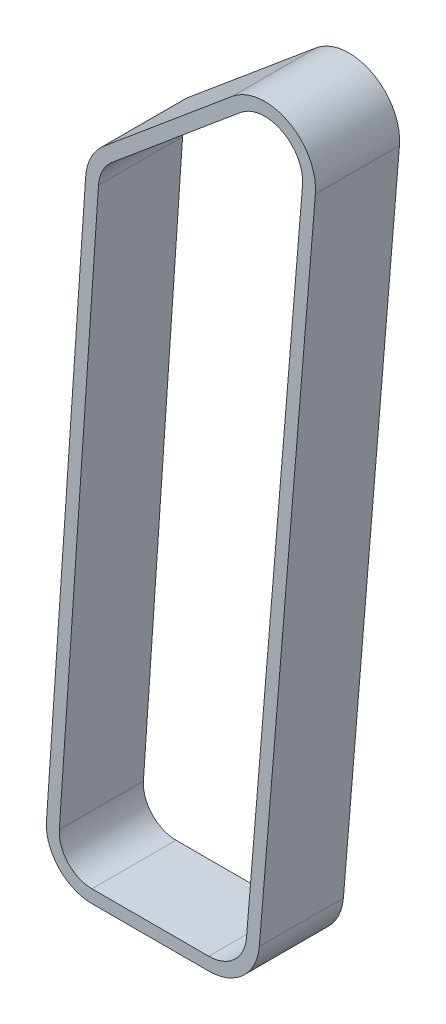
ISO-10303-21;
HEADER;
FILE_DESCRIPTION(('STEP AP214'),'2;1');
FILE_NAME('part.step','',(''),(''),'','','');
FILE_SCHEMA(('AUTOMOTIVE_DESIGN { 1 0 10303 214 1 1 1 1 }'));
ENDSEC;
DATA;
#1=APPLICATION_CONTEXT('core data for automotive mechanical design processes');
#2=APPLICATION_PROTOCOL_DEFINITION('international standard','automotive_design',2000,#1);
#3=PRODUCT_CONTEXT('',#1,'mechanical');
#4=PRODUCT('Part','Part','',(#3));
#5=PRODUCT_RELATED_PRODUCT_CATEGORY('part','',(#4));
#6=PRODUCT_DEFINITION_FORMATION('','',#4);
#7=PRODUCT_DEFINITION_CONTEXT('part definition',#1,'design');
#8=PRODUCT_DEFINITION('design','',#6,#7);
#9=PRODUCT_DEFINITION_SHAPE('','',#8);
#10=(LENGTH_UNIT() NAMED_UNIT(*) SI_UNIT(.MILLI.,.METRE.));
#11=(NAMED_UNIT(*) PLANE_ANGLE_UNIT() SI_UNIT($,.RADIAN.));
#12=(NAMED_UNIT(*) SI_UNIT($,.STERADIAN.) SOLID_ANGLE_UNIT());
#13=UNCERTAINTY_MEASURE_WITH_UNIT(LENGTH_MEASURE(1.E-05),#10,'distance_accuracy_value','');
#14=(GEOMETRIC_REPRESENTATION_CONTEXT(3) GLOBAL_UNCERTAINTY_ASSIGNED_CONTEXT((#13)) GLOBAL_UNIT_ASSIGNED_CONTEXT((#10,
#11,#12)) REPRESENTATION_CONTEXT('',''));
#15=CARTESIAN_POINT('',(0.,0.,0.));
#16=DIRECTION('',(0.,0.,1.));
#17=DIRECTION('',(1.,0.,0.));
#18=AXIS2_PLACEMENT_3D('',#15,#16,#17);
#19=CARTESIAN_POINT('',(17.0566896246943,83.,9.));
#20=DIRECTION('',(0.,0.,-1.));
#21=DIRECTION('',(-1.,0.,0.));
#22=AXIS2_PLACEMENT_3D('',#19,#20,#21);
#23=CYLINDRICAL_SURFACE('',#22,4.05);
#24=CARTESIAN_POINT('',(17.0566896246943,83.,0.));
#25=DIRECTION('',(0.,0.,1.));
#26=DIRECTION('',(1.,0.,0.));
#27=AXIS2_PLACEMENT_3D('',#24,#25,#26);
#28=CIRCLE('',#27,4.05);
#29=CARTESIAN_POINT('',(21.0929839514263,82.6670914419983,0.));
#30=VERTEX_POINT('',#29);
#31=CARTESIAN_POINT('',(14.4592790918921,86.1074038237873,0.));
#32=VERTEX_POINT('',#31);
#33=EDGE_CURVE('E208',#30,#32,#28,.T.);
#34=ORIENTED_EDGE('',*,*,#33,.F.);
#35=DIRECTION('',(0.,0.,-1.));
#36=VECTOR('',#35,1.);
#37=CARTESIAN_POINT('',(21.0929839514263,82.6670914419983,9.));
#38=LINE('',#37,#36);
#39=CARTESIAN_POINT('',(21.0929839514263,82.6670914419983,9.));
#40=VERTEX_POINT('',#39);
#41=EDGE_CURVE('E11',#40,#30,#38,.T.);
#42=ORIENTED_EDGE('',*,*,#41,.F.);
#43=CARTESIAN_POINT('',(17.0566896246943,83.,9.));
#44=DIRECTION('',(0.,0.,1.));
#45=DIRECTION('',(1.,0.,0.));
#46=AXIS2_PLACEMENT_3D('',#43,#44,#45);
#47=CIRCLE('',#46,4.05);
#48=CARTESIAN_POINT('',(14.4592790918921,86.1074038237873,9.));
#49=VERTEX_POINT('',#48);
#50=EDGE_CURVE('E293',#40,#49,#47,.T.);
#51=ORIENTED_EDGE('',*,*,#50,.T.);
#52=DIRECTION('',(0.,0.,-1.));
#53=VECTOR('',#52,1.);
#54=CARTESIAN_POINT('',(14.4592790918921,86.1074038237873,9.));
#55=LINE('',#54,#53);
#56=EDGE_CURVE('E60',#49,#32,#55,.T.);
#57=ORIENTED_EDGE('',*,*,#56,.T.);
#58=EDGE_LOOP('',(#34,#42,#51,#57));
#59=FACE_BOUND('',#58,.T.);
#60=ADVANCED_FACE('F41',(#59),#23,.F.);
#61=CARTESIAN_POINT('',(14.1782535548242,-1.16940479653789,9.));
#62=DIRECTION('',(-0.996615883143713,0.0821996439510389,0.));
#63=DIRECTION('',(-0.0821996439510389,-0.996615883143713,0.));
#64=AXIS2_PLACEMENT_3D('',#61,#62,#63);
#65=PLANE('',#64);
#66=DIRECTION('',(0.0821996439510389,0.996615883143713,0.));
#67=VECTOR('',#66,1.);
#68=CARTESIAN_POINT('',(14.1782535548242,-1.16940479653789,0.));
#69=LINE('',#68,#67);
#70=CARTESIAN_POINT('',(15.0929839514263,9.92109144199829,0.));
#71=VERTEX_POINT('',#70);
#72=EDGE_CURVE('E210',#71,#30,#69,.T.);
#73=ORIENTED_EDGE('',*,*,#72,.F.);
#74=DIRECTION('',(0.,0.,-1.));
#75=VECTOR('',#74,1.);
#76=CARTESIAN_POINT('',(15.0929839514263,9.92109144199829,9.));
#77=LINE('',#76,#75);
#78=CARTESIAN_POINT('',(15.0929839514263,9.92109144199829,9.));
#79=VERTEX_POINT('',#78);
#80=EDGE_CURVE('E51',#79,#71,#77,.T.);
#81=ORIENTED_EDGE('',*,*,#80,.F.);
#82=DIRECTION('',(0.0821996439510389,0.996615883143713,0.));
#83=VECTOR('',#82,1.);
#84=CARTESIAN_POINT('',(14.1782535548242,-1.16940479653789,9.));
#85=LINE('',#84,#83);
#86=EDGE_CURVE('E295',#79,#40,#85,.T.);
#87=ORIENTED_EDGE('',*,*,#86,.T.);
#88=ORIENTED_EDGE('',*,*,#41,.T.);
#89=EDGE_LOOP('',(#73,#81,#87,#88));
#90=FACE_BOUND('',#89,.T.);
#91=ADVANCED_FACE('F322',(#90),#65,.T.);
#92=CARTESIAN_POINT('',(11.0566896246943,10.254,9.));
#93=DIRECTION('',(0.,0.,-1.));
#94=DIRECTION('',(-1.,0.,0.));
#95=AXIS2_PLACEMENT_3D('',#92,#93,#94);
#96=CYLINDRICAL_SURFACE('',#95,4.05);
#97=CARTESIAN_POINT('',(11.0566896246943,10.254,0.));
#98=DIRECTION('',(0.,0.,1.));
#99=DIRECTION('',(1.,0.,0.));
#100=AXIS2_PLACEMENT_3D('',#97,#98,#99);
#101=CIRCLE('',#100,4.05);
#102=CARTESIAN_POINT('',(11.0566896246943,6.204,0.));
#103=VERTEX_POINT('',#102);
#104=EDGE_CURVE('E213',#103,#71,#101,.T.);
#105=ORIENTED_EDGE('',*,*,#104,.F.);
#106=DIRECTION('',(0.,0.,-1.));
#107=VECTOR('',#106,1.);
#108=CARTESIAN_POINT('',(11.0566896246943,6.204,9.));
#109=LINE('',#108,#107);
#110=CARTESIAN_POINT('',(11.0566896246943,6.204,9.));
#111=VERTEX_POINT('',#110);
#112=EDGE_CURVE('E234',#111,#103,#109,.T.);
#113=ORIENTED_EDGE('',*,*,#112,.F.);
#114=CARTESIAN_POINT('',(11.0566896246943,10.254,9.));
#115=DIRECTION('',(0.,0.,1.));
#116=DIRECTION('',(1.,0.,0.));
#117=AXIS2_PLACEMENT_3D('',#114,#115,#116);
#118=CIRCLE('',#117,4.05);
#119=EDGE_CURVE('E298',#111,#79,#118,.T.);
#120=ORIENTED_EDGE('',*,*,#119,.T.);
#121=ORIENTED_EDGE('',*,*,#80,.T.);
#122=EDGE_LOOP('',(#105,#113,#120,#121));
#123=FACE_BOUND('',#122,.T.);
#124=ADVANCED_FACE('F327',(#123),#96,.F.);
#125=CARTESIAN_POINT('',(0.,6.204,9.));
#126=DIRECTION('',(0.,1.,0.));
#127=DIRECTION('',(-1.,0.,0.));
#128=AXIS2_PLACEMENT_3D('',#125,#126,#127);
#129=PLANE('',#128);
#130=DIRECTION('',(1.,0.,0.));
#131=VECTOR('',#130,1.);
#132=CARTESIAN_POINT('',(0.,6.204,0.));
#133=LINE('',#132,#131);
#134=CARTESIAN_POINT('',(-1.44331037530571,6.204,0.));
#135=VERTEX_POINT('',#134);
#136=EDGE_CURVE('E216',#135,#103,#133,.T.);
#137=ORIENTED_EDGE('',*,*,#136,.F.);
#138=DIRECTION('',(0.,0.,-1.));
#139=VECTOR('',#138,1.);
#140=CARTESIAN_POINT('',(-1.44331037530571,6.204,9.));
#141=LINE('',#140,#139);
#142=CARTESIAN_POINT('',(-1.44331037530571,6.204,9.));
#143=VERTEX_POINT('',#142);
#144=EDGE_CURVE('E232',#143,#135,#141,.T.);
#145=ORIENTED_EDGE('',*,*,#144,.F.);
#146=DIRECTION('',(1.,0.,0.));
#147=VECTOR('',#146,1.);
#148=CARTESIAN_POINT('',(0.,6.204,9.));
#149=LINE('',#148,#147);
#150=EDGE_CURVE('E301',#143,#111,#149,.T.);
#151=ORIENTED_EDGE('',*,*,#150,.T.);
#152=ORIENTED_EDGE('',*,*,#112,.T.);
#153=EDGE_LOOP('',(#137,#145,#151,#152));
#154=FACE_BOUND('',#153,.T.);
#155=ADVANCED_FACE('F360',(#154),#129,.T.);
#156=CARTESIAN_POINT('',(-1.44331037530571,9.705,9.));
#157=DIRECTION('',(0.,0.,-1.));
#158=DIRECTION('',(-1.,0.,0.));
#159=AXIS2_PLACEMENT_3D('',#156,#157,#158);
#160=CYLINDRICAL_SURFACE('',#159,3.501);
#161=CARTESIAN_POINT('',(-1.44331037530571,9.705,0.));
#162=DIRECTION('',(0.,0.,1.));
#163=DIRECTION('',(1.,0.,0.));
#164=AXIS2_PLACEMENT_3D('',#161,#162,#163);
#165=CIRCLE('',#164,3.501);
#166=CARTESIAN_POINT('',(-4.93628342480396,9.94193939199479,0.));
#167=VERTEX_POINT('',#166);
#168=EDGE_CURVE('E219',#167,#135,#165,.T.);
#169=ORIENTED_EDGE('',*,*,#168,.F.);
#170=DIRECTION('',(0.,0.,-1.));
#171=VECTOR('',#170,1.);
#172=CARTESIAN_POINT('',(-4.93628342480396,9.94193939199479,9.));
#173=LINE('',#172,#171);
#174=CARTESIAN_POINT('',(-4.93628342480396,9.94193939199479,9.));
#175=VERTEX_POINT('',#174);
#176=EDGE_CURVE('E171',#175,#167,#173,.T.);
#177=ORIENTED_EDGE('',*,*,#176,.F.);
#178=CARTESIAN_POINT('',(-1.44331037530571,9.705,9.));
#179=DIRECTION('',(0.,0.,1.));
#180=DIRECTION('',(1.,0.,0.));
#181=AXIS2_PLACEMENT_3D('',#178,#179,#180);
#182=CIRCLE('',#181,3.501);
#183=EDGE_CURVE('E182',#175,#143,#182,.T.);
#184=ORIENTED_EDGE('',*,*,#183,.T.);
#185=ORIENTED_EDGE('',*,*,#144,.T.);
#186=EDGE_LOOP('',(#169,#177,#184,#185));
#187=FACE_BOUND('',#186,.T.);
#188=ADVANCED_FACE('F305',(#187),#160,.F.);
#189=CARTESIAN_POINT('',(-5.58497819975959,0.378846707433246,9.));
#190=DIRECTION('',(0.99770724064503,-0.0676776326749045,0.));
#191=DIRECTION('',(0.0676776326749045,0.99770724064503,0.));
#192=AXIS2_PLACEMENT_3D('',#189,#190,#191);
#193=PLANE('',#192);
#194=DIRECTION('',(-0.0676776326749045,-0.99770724064503,0.));
#195=VECTOR('',#194,1.);
#196=CARTESIAN_POINT('',(-5.58497819975959,0.378846707433246,0.));
#197=LINE('',#196,#195);
#198=CARTESIAN_POINT('',(-0.742013097309097,71.7740944123334,0.));
#199=VERTEX_POINT('',#198);
#200=EDGE_CURVE('E167',#199,#167,#197,.T.);
#201=ORIENTED_EDGE('',*,*,#200,.F.);
#202=DIRECTION('',(0.,0.,-1.));
#203=VECTOR('',#202,1.);
#204=CARTESIAN_POINT('',(-0.742013097309097,71.7740944123334,9.));
#205=LINE('',#204,#203);
#206=CARTESIAN_POINT('',(-0.742013097309097,71.7740944123334,9.));
#207=VERTEX_POINT('',#206);
#208=EDGE_CURVE('E162',#207,#199,#205,.T.);
#209=ORIENTED_EDGE('',*,*,#208,.F.);
#210=DIRECTION('',(-0.0676776326749045,-0.99770724064503,0.));
#211=VECTOR('',#210,1.);
#212=CARTESIAN_POINT('',(-5.58497819975959,0.378846707433246,9.));
#213=LINE('',#212,#211);
#214=EDGE_CURVE('E165',#207,#175,#213,.T.);
#215=ORIENTED_EDGE('',*,*,#214,.T.);
#216=ORIENTED_EDGE('',*,*,#176,.T.);
#217=EDGE_LOOP('',(#201,#209,#215,#216));
#218=FACE_BOUND('',#217,.T.);
#219=ADVANCED_FACE('F164',(#218),#193,.T.);
#220=CARTESIAN_POINT('',(3.29870122730328,71.5,9.));
#221=DIRECTION('',(0.,0.,-1.));
#222=DIRECTION('',(-1.,0.,0.));
#223=AXIS2_PLACEMENT_3D('',#220,#221,#222);
#224=CYLINDRICAL_SURFACE('',#223,4.05);
#225=CARTESIAN_POINT('',(3.29870122730328,71.5,0.));
#226=DIRECTION('',(0.,0.,1.));
#227=DIRECTION('',(1.,0.,0.));
#228=AXIS2_PLACEMENT_3D('',#225,#226,#227);
#229=CIRCLE('',#228,4.05);
#230=CARTESIAN_POINT('',(0.701290694501054,74.6074038237874,0.));
#231=VERTEX_POINT('',#230);
#232=EDGE_CURVE('E223',#231,#199,#229,.T.);
#233=ORIENTED_EDGE('',*,*,#232,.F.);
#234=DIRECTION('',(0.,0.,-1.));
#235=VECTOR('',#234,1.);
#236=CARTESIAN_POINT('',(0.701290694501054,74.6074038237874,9.));
#237=LINE('',#236,#235);
#238=CARTESIAN_POINT('',(0.701290694501054,74.6074038237874,9.));
#239=VERTEX_POINT('',#238);
#240=EDGE_CURVE('E109',#239,#231,#237,.T.);
#241=ORIENTED_EDGE('',*,*,#240,.F.);
#242=CARTESIAN_POINT('',(3.29870122730328,71.5,9.));
#243=DIRECTION('',(0.,0.,1.));
#244=DIRECTION('',(1.,0.,0.));
#245=AXIS2_PLACEMENT_3D('',#242,#243,#244);
#246=CIRCLE('',#245,4.05);
#247=EDGE_CURVE('E179',#239,#207,#246,.T.);
#248=ORIENTED_EDGE('',*,*,#247,.T.);
#249=ORIENTED_EDGE('',*,*,#208,.T.);
#250=EDGE_LOOP('',(#233,#241,#248,#249));
#251=FACE_BOUND('',#250,.T.);
#252=ADVANCED_FACE('F184',(#251),#224,.F.);
#253=CARTESIAN_POINT('',(15.5535834735625,-1.28284030519032,9.));
#254=DIRECTION('',(-0.996615883143713,0.0821996439510389,0.));
#255=DIRECTION('',(-0.082199643951039,-0.996615883143713,0.));
#256=AXIS2_PLACEMENT_3D('',#253,#254,#255);
#257=PLANE('',#256);
#258=DIRECTION('',(0.082199643951039,0.996615883143713,0.));
#259=VECTOR('',#258,1.);
#260=CARTESIAN_POINT('',(15.5535834735625,-1.28284030519032,0.));
#261=LINE('',#260,#259);
#262=CARTESIAN_POINT('',(16.4683138701646,9.80765593334586,0.));
#263=VERTEX_POINT('',#262);
#264=CARTESIAN_POINT('',(22.4683138701647,82.5536559333459,0.));
#265=VERTEX_POINT('',#264);
#266=EDGE_CURVE('E191',#263,#265,#261,.T.);
#267=ORIENTED_EDGE('',*,*,#266,.T.);
#268=DIRECTION('',(0.,0.,-1.));
#269=VECTOR('',#268,1.);
#270=CARTESIAN_POINT('',(22.4683138701647,82.5536559333459,9.));
#271=LINE('',#270,#269);
#272=CARTESIAN_POINT('',(22.4683138701647,82.5536559333459,9.));
#273=VERTEX_POINT('',#272);
#274=EDGE_CURVE('E45',#273,#265,#271,.T.);
#275=ORIENTED_EDGE('',*,*,#274,.F.);
#276=DIRECTION('',(0.082199643951039,0.996615883143713,0.));
#277=VECTOR('',#276,1.);
#278=CARTESIAN_POINT('',(15.5535834735625,-1.28284030519032,9.));
#279=LINE('',#278,#277);
#280=CARTESIAN_POINT('',(16.4683138701646,9.80765593334586,9.));
#281=VERTEX_POINT('',#280);
#282=EDGE_CURVE('E228',#281,#273,#279,.T.);
#283=ORIENTED_EDGE('',*,*,#282,.F.);
#284=DIRECTION('',(0.,0.,-1.));
#285=VECTOR('',#284,1.);
#286=CARTESIAN_POINT('',(16.4683138701646,9.80765593334586,9.));
#287=LINE('',#286,#285);
#288=EDGE_CURVE('E187',#281,#263,#287,.T.);
#289=ORIENTED_EDGE('',*,*,#288,.T.);
#290=EDGE_LOOP('',(#267,#275,#283,#289));
#291=FACE_BOUND('',#290,.T.);
#292=ADVANCED_FACE('F43',(#291),#257,.F.);
#293=CARTESIAN_POINT('',(17.0566896246943,83.,9.));
#294=DIRECTION('',(0.,0.,-1.));
#295=DIRECTION('',(-1.,0.,0.));
#296=AXIS2_PLACEMENT_3D('',#293,#294,#295);
#297=CYLINDRICAL_SURFACE('',#296,5.43);
#298=CARTESIAN_POINT('',(17.0566896246943,83.,0.));
#299=DIRECTION('',(0.,0.,1.));
#300=DIRECTION('',(1.,0.,0.));
#301=AXIS2_PLACEMENT_3D('',#298,#299,#300);
#302=CIRCLE('',#301,5.43);
#303=CARTESIAN_POINT('',(13.5742355029372,87.1662229044853,0.));
#304=VERTEX_POINT('',#303);
#305=EDGE_CURVE('E194',#265,#304,#302,.T.);
#306=ORIENTED_EDGE('',*,*,#305,.T.);
#307=DIRECTION('',(0.,0.,-1.));
#308=VECTOR('',#307,1.);
#309=CARTESIAN_POINT('',(13.5742355029372,87.1662229044853,9.));
#310=LINE('',#309,#308);
#311=CARTESIAN_POINT('',(13.5742355029372,87.1662229044853,9.));
#312=VERTEX_POINT('',#311);
#313=EDGE_CURVE('E253',#312,#304,#310,.T.);
#314=ORIENTED_EDGE('',*,*,#313,.F.);
#315=CARTESIAN_POINT('',(17.0566896246943,83.,9.));
#316=DIRECTION('',(0.,0.,1.));
#317=DIRECTION('',(1.,0.,0.));
#318=AXIS2_PLACEMENT_3D('',#315,#316,#317);
#319=CIRCLE('',#318,5.43);
#320=EDGE_CURVE('E122',#273,#312,#319,.T.);
#321=ORIENTED_EDGE('',*,*,#320,.F.);
#322=ORIENTED_EDGE('',*,*,#274,.T.);
#323=EDGE_LOOP('',(#306,#314,#321,#322));
#324=FACE_BOUND('',#323,.T.);
#325=ADVANCED_FACE('F259',(#324),#297,.T.);
#326=CARTESIAN_POINT('',(-37.3087744995029,44.634233624786,9.));
#327=DIRECTION('',(0.64133593402524,-0.767260203404277,0.));
#328=DIRECTION('',(0.767260203404277,0.64133593402524,0.));
#329=AXIS2_PLACEMENT_3D('',#326,#327,#328);
#330=PLANE('',#329);
#331=DIRECTION('',(-0.767260203404277,-0.64133593402524,0.));
#332=VECTOR('',#331,1.);
#333=CARTESIAN_POINT('',(-37.3087744995029,44.634233624786,0.));
#334=LINE('',#333,#332);
#335=CARTESIAN_POINT('',(-0.183752894453777,75.6662229044853,0.));
#336=VERTEX_POINT('',#335);
#337=EDGE_CURVE('E196',#304,#336,#334,.T.);
#338=ORIENTED_EDGE('',*,*,#337,.T.);
#339=DIRECTION('',(0.,0.,-1.));
#340=VECTOR('',#339,1.);
#341=CARTESIAN_POINT('',(-0.183752894453777,75.6662229044853,9.));
#342=LINE('',#341,#340);
#343=CARTESIAN_POINT('',(-0.183752894453777,75.6662229044853,9.));
#344=VERTEX_POINT('',#343);
#345=EDGE_CURVE('E251',#344,#336,#342,.T.);
#346=ORIENTED_EDGE('',*,*,#345,.F.);
#347=DIRECTION('',(-0.767260203404277,-0.64133593402524,0.));
#348=VECTOR('',#347,1.);
#349=CARTESIAN_POINT('',(-37.3087744995029,44.634233624786,9.));
#350=LINE('',#349,#348);
#351=EDGE_CURVE('E281',#312,#344,#350,.T.);
#352=ORIENTED_EDGE('',*,*,#351,.F.);
#353=ORIENTED_EDGE('',*,*,#313,.T.);
#354=EDGE_LOOP('',(#338,#346,#352,#353));
#355=FACE_BOUND('',#354,.T.);
#356=ADVANCED_FACE('F272',(#355),#330,.F.);
#357=CARTESIAN_POINT('',(3.29870122730328,71.5,9.));
#358=DIRECTION('',(0.,0.,-1.));
#359=DIRECTION('',(-1.,0.,0.));
#360=AXIS2_PLACEMENT_3D('',#357,#358,#359);
#361=CYLINDRICAL_SURFACE('',#360,5.43000000000001);
#362=CARTESIAN_POINT('',(3.29870122730328,71.5,0.));
#363=DIRECTION('',(0.,0.,1.));
#364=DIRECTION('',(1.,0.,0.));
#365=AXIS2_PLACEMENT_3D('',#362,#363,#364);
#366=CIRCLE('',#365,5.43000000000001);
#367=CARTESIAN_POINT('',(-2.11884908939924,71.8674895454248,0.));
#368=VERTEX_POINT('',#367);
#369=EDGE_CURVE('E198',#336,#368,#366,.T.);
#370=ORIENTED_EDGE('',*,*,#369,.T.);
#371=DIRECTION('',(0.,0.,-1.));
#372=VECTOR('',#371,1.);
#373=CARTESIAN_POINT('',(-2.11884908939924,71.8674895454248,9.));
#374=LINE('',#373,#372);
#375=CARTESIAN_POINT('',(-2.11884908939924,71.8674895454248,9.));
#376=VERTEX_POINT('',#375);
#377=EDGE_CURVE('E248',#376,#368,#374,.T.);
#378=ORIENTED_EDGE('',*,*,#377,.F.);
#379=CARTESIAN_POINT('',(3.29870122730328,71.5,9.));
#380=DIRECTION('',(0.,0.,1.));
#381=DIRECTION('',(1.,0.,0.));
#382=AXIS2_PLACEMENT_3D('',#379,#380,#381);
#383=CIRCLE('',#382,5.43000000000001);
#384=EDGE_CURVE('E277',#344,#376,#383,.T.);
#385=ORIENTED_EDGE('',*,*,#384,.F.);
#386=ORIENTED_EDGE('',*,*,#345,.T.);
#387=EDGE_LOOP('',(#370,#378,#385,#386));
#388=FACE_BOUND('',#387,.T.);
#389=ADVANCED_FACE('F275',(#388),#361,.T.);
#390=CARTESIAN_POINT('',(-6.96181419184973,0.472241840524614,9.));
#391=DIRECTION('',(0.99770724064503,-0.0676776326749046,0.));
#392=DIRECTION('',(0.0676776326749046,0.99770724064503,0.));
#393=AXIS2_PLACEMENT_3D('',#390,#391,#392);
#394=PLANE('',#393);
#395=DIRECTION('',(-0.0676776326749046,-0.99770724064503,0.));
#396=VECTOR('',#395,1.);
#397=CARTESIAN_POINT('',(-6.96181419184973,0.472241840524614,0.));
#398=LINE('',#397,#396);
#399=CARTESIAN_POINT('',(-6.31311941689411,10.0353345250862,0.));
#400=VERTEX_POINT('',#399);
#401=EDGE_CURVE('E200',#368,#400,#398,.T.);
#402=ORIENTED_EDGE('',*,*,#401,.T.);
#403=DIRECTION('',(0.,0.,-1.));
#404=VECTOR('',#403,1.);
#405=CARTESIAN_POINT('',(-6.31311941689411,10.0353345250862,9.));
#406=LINE('',#405,#404);
#407=CARTESIAN_POINT('',(-6.31311941689411,10.0353345250862,9.));
#408=VERTEX_POINT('',#407);
#409=EDGE_CURVE('E245',#408,#400,#406,.T.);
#410=ORIENTED_EDGE('',*,*,#409,.F.);
#411=DIRECTION('',(-0.0676776326749046,-0.99770724064503,0.));
#412=VECTOR('',#411,1.);
#413=CARTESIAN_POINT('',(-6.96181419184973,0.472241840524614,9.));
#414=LINE('',#413,#412);
#415=EDGE_CURVE('E280',#376,#408,#414,.T.);
#416=ORIENTED_EDGE('',*,*,#415,.F.);
#417=ORIENTED_EDGE('',*,*,#377,.T.);
#418=EDGE_LOOP('',(#402,#410,#416,#417));
#419=FACE_BOUND('',#418,.T.);
#420=ADVANCED_FACE('F338',(#419),#394,.F.);
#421=CARTESIAN_POINT('',(-1.44331037530571,9.705,9.));
#422=DIRECTION('',(0.,0.,-1.));
#423=DIRECTION('',(-1.,0.,0.));
#424=AXIS2_PLACEMENT_3D('',#421,#422,#423);
#425=CYLINDRICAL_SURFACE('',#424,4.881);
#426=CARTESIAN_POINT('',(-1.44331037530571,9.705,0.));
#427=DIRECTION('',(0.,0.,1.));
#428=DIRECTION('',(1.,0.,0.));
#429=AXIS2_PLACEMENT_3D('',#426,#427,#428);
#430=CIRCLE('',#429,4.881);
#431=CARTESIAN_POINT('',(-1.44331037530571,4.824,0.));
#432=VERTEX_POINT('',#431);
#433=EDGE_CURVE('E202',#400,#432,#430,.T.);
#434=ORIENTED_EDGE('',*,*,#433,.T.);
#435=DIRECTION('',(0.,0.,-1.));
#436=VECTOR('',#435,1.);
#437=CARTESIAN_POINT('',(-1.44331037530571,4.824,9.));
#438=LINE('',#437,#436);
#439=CARTESIAN_POINT('',(-1.44331037530571,4.824,9.));
#440=VERTEX_POINT('',#439);
#441=EDGE_CURVE('E242',#440,#432,#438,.T.);
#442=ORIENTED_EDGE('',*,*,#441,.F.);
#443=CARTESIAN_POINT('',(-1.44331037530571,9.705,9.));
#444=DIRECTION('',(0.,0.,1.));
#445=DIRECTION('',(1.,0.,0.));
#446=AXIS2_PLACEMENT_3D('',#443,#444,#445);
#447=CIRCLE('',#446,4.881);
#448=EDGE_CURVE('E283',#408,#440,#447,.T.);
#449=ORIENTED_EDGE('',*,*,#448,.F.);
#450=ORIENTED_EDGE('',*,*,#409,.T.);
#451=EDGE_LOOP('',(#434,#442,#449,#450));
#452=FACE_BOUND('',#451,.T.);
#453=ADVANCED_FACE('F334',(#452),#425,.T.);
#454=CARTESIAN_POINT('',(0.,4.824,9.));
#455=DIRECTION('',(0.,1.,0.));
#456=DIRECTION('',(-1.,0.,0.));
#457=AXIS2_PLACEMENT_3D('',#454,#455,#456);
#458=PLANE('',#457);
#459=DIRECTION('',(1.,0.,0.));
#460=VECTOR('',#459,1.);
#461=CARTESIAN_POINT('',(0.,4.824,0.));
#462=LINE('',#461,#460);
#463=CARTESIAN_POINT('',(11.0566896246943,4.824,0.));
#464=VERTEX_POINT('',#463);
#465=EDGE_CURVE('E204',#432,#464,#462,.T.);
#466=ORIENTED_EDGE('',*,*,#465,.T.);
#467=DIRECTION('',(0.,0.,-1.));
#468=VECTOR('',#467,1.);
#469=CARTESIAN_POINT('',(11.0566896246943,4.824,9.));
#470=LINE('',#469,#468);
#471=CARTESIAN_POINT('',(11.0566896246943,4.824,9.));
#472=VERTEX_POINT('',#471);
#473=EDGE_CURVE('E239',#472,#464,#470,.T.);
#474=ORIENTED_EDGE('',*,*,#473,.F.);
#475=DIRECTION('',(1.,0.,0.));
#476=VECTOR('',#475,1.);
#477=CARTESIAN_POINT('',(0.,4.824,9.));
#478=LINE('',#477,#476);
#479=EDGE_CURVE('E289',#440,#472,#478,.T.);
#480=ORIENTED_EDGE('',*,*,#479,.F.);
#481=ORIENTED_EDGE('',*,*,#441,.T.);
#482=EDGE_LOOP('',(#466,#474,#480,#481));
#483=FACE_BOUND('',#482,.T.);
#484=ADVANCED_FACE('F316',(#483),#458,.F.);
#485=CARTESIAN_POINT('',(11.0566896246943,10.254,9.));
#486=DIRECTION('',(0.,0.,-1.));
#487=DIRECTION('',(-1.,0.,0.));
#488=AXIS2_PLACEMENT_3D('',#485,#486,#487);
#489=CYLINDRICAL_SURFACE('',#488,5.43);
#490=CARTESIAN_POINT('',(11.0566896246943,10.254,0.));
#491=DIRECTION('',(0.,0.,1.));
#492=DIRECTION('',(1.,0.,0.));
#493=AXIS2_PLACEMENT_3D('',#490,#491,#492);
#494=CIRCLE('',#493,5.43);
#495=EDGE_CURVE('E206',#464,#263,#494,.T.);
#496=ORIENTED_EDGE('',*,*,#495,.T.);
#497=ORIENTED_EDGE('',*,*,#288,.F.);
#498=CARTESIAN_POINT('',(11.0566896246943,10.254,9.));
#499=DIRECTION('',(0.,0.,1.));
#500=DIRECTION('',(1.,0.,0.));
#501=AXIS2_PLACEMENT_3D('',#498,#499,#500);
#502=CIRCLE('',#501,5.43);
#503=EDGE_CURVE('E291',#472,#281,#502,.T.);
#504=ORIENTED_EDGE('',*,*,#503,.F.);
#505=ORIENTED_EDGE('',*,*,#473,.T.);
#506=EDGE_LOOP('',(#496,#497,#504,#505));
#507=FACE_BOUND('',#506,.T.);
#508=ADVANCED_FACE('F309',(#507),#489,.T.);
#509=CARTESIAN_POINT('',(-36.4237309105481,43.5754145440881,9.));
#510=DIRECTION('',(0.64133593402524,-0.767260203404278,0.));
#511=DIRECTION('',(0.767260203404278,0.64133593402524,0.));
#512=AXIS2_PLACEMENT_3D('',#509,#510,#511);
#513=PLANE('',#512);
#514=DIRECTION('',(-0.767260203404278,-0.64133593402524,0.));
#515=VECTOR('',#514,1.);
#516=CARTESIAN_POINT('',(-36.4237309105481,43.5754145440881,0.));
#517=LINE('',#516,#515);
#518=EDGE_CURVE('E225',#32,#231,#517,.T.);
#519=ORIENTED_EDGE('',*,*,#518,.F.);
#520=ORIENTED_EDGE('',*,*,#56,.F.);
#521=DIRECTION('',(-0.767260203404278,-0.64133593402524,0.));
#522=VECTOR('',#521,1.);
#523=CARTESIAN_POINT('',(-36.4237309105481,43.5754145440881,9.));
#524=LINE('',#523,#522);
#525=EDGE_CURVE('E185',#49,#239,#524,.T.);
#526=ORIENTED_EDGE('',*,*,#525,.T.);
#527=ORIENTED_EDGE('',*,*,#240,.T.);
#528=EDGE_LOOP('',(#519,#520,#526,#527));
#529=FACE_BOUND('',#528,.T.);
#530=ADVANCED_FACE('F307',(#529),#513,.T.);
#531=CARTESIAN_POINT('',(0.,0.,9.));
#532=DIRECTION('',(0.,0.,1.));
#533=DIRECTION('',(1.,0.,0.));
#534=AXIS2_PLACEMENT_3D('',#531,#532,#533);
#535=PLANE('',#534);
#536=ORIENTED_EDGE('',*,*,#282,.T.);
#537=ORIENTED_EDGE('',*,*,#320,.T.);
#538=ORIENTED_EDGE('',*,*,#351,.T.);
#539=ORIENTED_EDGE('',*,*,#384,.T.);
#540=ORIENTED_EDGE('',*,*,#415,.T.);
#541=ORIENTED_EDGE('',*,*,#448,.T.);
#542=ORIENTED_EDGE('',*,*,#479,.T.);
#543=ORIENTED_EDGE('',*,*,#503,.T.);
#544=EDGE_LOOP('',(#536,#537,#538,#539,#540,#541,#542,#543));
#545=FACE_BOUND('',#544,.T.);
#546=ORIENTED_EDGE('',*,*,#50,.F.);
#547=ORIENTED_EDGE('',*,*,#86,.F.);
#548=ORIENTED_EDGE('',*,*,#119,.F.);
#549=ORIENTED_EDGE('',*,*,#150,.F.);
#550=ORIENTED_EDGE('',*,*,#183,.F.);
#551=ORIENTED_EDGE('',*,*,#214,.F.);
#552=ORIENTED_EDGE('',*,*,#247,.F.);
#553=ORIENTED_EDGE('',*,*,#525,.F.);
#554=EDGE_LOOP('',(#546,#547,#548,#549,#550,#551,#552,#553));
#555=FACE_BOUND('',#554,.T.);
#556=ADVANCED_FACE('F177',(#545,#555),#535,.T.);
#557=CARTESIAN_POINT('',(0.,0.,0.));
#558=DIRECTION('',(0.,0.,1.));
#559=DIRECTION('',(1.,0.,0.));
#560=AXIS2_PLACEMENT_3D('',#557,#558,#559);
#561=PLANE('',#560);
#562=ORIENTED_EDGE('',*,*,#266,.F.);
#563=ORIENTED_EDGE('',*,*,#495,.F.);
#564=ORIENTED_EDGE('',*,*,#465,.F.);
#565=ORIENTED_EDGE('',*,*,#433,.F.);
#566=ORIENTED_EDGE('',*,*,#401,.F.);
#567=ORIENTED_EDGE('',*,*,#369,.F.);
#568=ORIENTED_EDGE('',*,*,#337,.F.);
#569=ORIENTED_EDGE('',*,*,#305,.F.);
#570=EDGE_LOOP('',(#562,#563,#564,#565,#566,#567,#568,#569));
#571=FACE_BOUND('',#570,.T.);
#572=ORIENTED_EDGE('',*,*,#33,.T.);
#573=ORIENTED_EDGE('',*,*,#518,.T.);
#574=ORIENTED_EDGE('',*,*,#232,.T.);
#575=ORIENTED_EDGE('',*,*,#200,.T.);
#576=ORIENTED_EDGE('',*,*,#168,.T.);
#577=ORIENTED_EDGE('',*,*,#136,.T.);
#578=ORIENTED_EDGE('',*,*,#104,.T.);
#579=ORIENTED_EDGE('',*,*,#72,.T.);
#580=EDGE_LOOP('',(#572,#573,#574,#575,#576,#577,#578,#579));
#581=FACE_BOUND('',#580,.T.);
#582=ADVANCED_FACE('F266',(#571,#581),#561,.F.);
#583=CLOSED_SHELL('',(#60,#91,#124,#155,#188,#219,#252,#292,#325,#356,#389,#420,#453,#484,#508,
#530,#556,#582));
#584=MANIFOLD_SOLID_BREP('B2',#583);
#585=ADVANCED_BREP_SHAPE_REPRESENTATION('',(#18,#584),#14);
#586=SHAPE_DEFINITION_REPRESENTATION(#9,#585);
ENDSEC;
END-ISO-10303-21;
